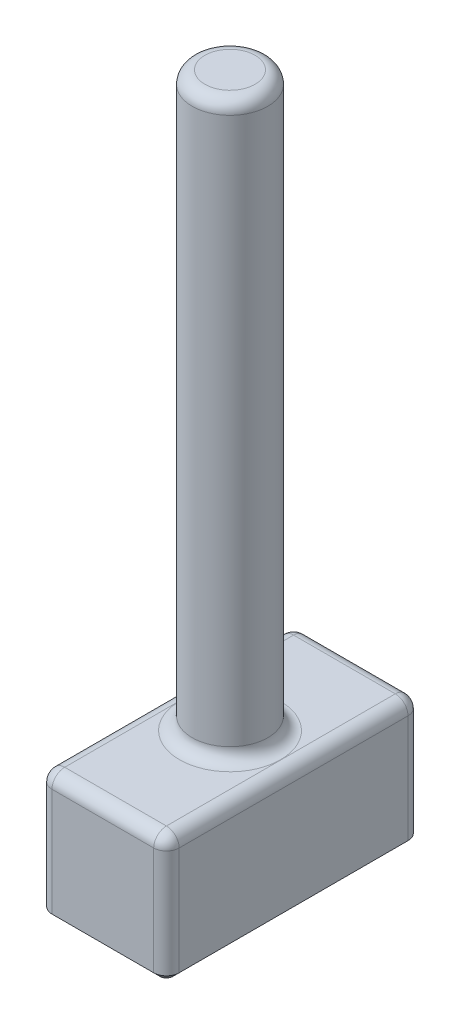
ISO-10303-21;
HEADER;
FILE_DESCRIPTION(('STEP AP214'),'2;1');
FILE_NAME('part.step','',(''),(''),'','','');
FILE_SCHEMA(('AUTOMOTIVE_DESIGN { 1 0 10303 214 1 1 1 1 }'));
ENDSEC;
DATA;
#1=APPLICATION_CONTEXT('core data for automotive mechanical design processes');
#2=APPLICATION_PROTOCOL_DEFINITION('international standard','automotive_design',2000,#1);
#3=PRODUCT_CONTEXT('',#1,'mechanical');
#4=PRODUCT('Part','Part','',(#3));
#5=PRODUCT_RELATED_PRODUCT_CATEGORY('part','',(#4));
#6=PRODUCT_DEFINITION_FORMATION('','',#4);
#7=PRODUCT_DEFINITION_CONTEXT('part definition',#1,'design');
#8=PRODUCT_DEFINITION('design','',#6,#7);
#9=PRODUCT_DEFINITION_SHAPE('','',#8);
#10=(LENGTH_UNIT() NAMED_UNIT(*) SI_UNIT(.MILLI.,.METRE.));
#11=(NAMED_UNIT(*) PLANE_ANGLE_UNIT() SI_UNIT($,.RADIAN.));
#12=(NAMED_UNIT(*) SI_UNIT($,.STERADIAN.) SOLID_ANGLE_UNIT());
#13=UNCERTAINTY_MEASURE_WITH_UNIT(LENGTH_MEASURE(1.E-05),#10,'distance_accuracy_value','');
#14=(GEOMETRIC_REPRESENTATION_CONTEXT(3) GLOBAL_UNCERTAINTY_ASSIGNED_CONTEXT((#13)) GLOBAL_UNIT_ASSIGNED_CONTEXT((#10,
#11,#12)) REPRESENTATION_CONTEXT('',''));
#15=CARTESIAN_POINT('',(0.,0.,0.));
#16=DIRECTION('',(0.,0.,1.));
#17=DIRECTION('',(1.,0.,0.));
#18=AXIS2_PLACEMENT_3D('',#15,#16,#17);
#19=CARTESIAN_POINT('',(0.,50.,0.));
#20=DIRECTION('',(0.,-1.,0.));
#21=DIRECTION('',(0.,0.,-1.));
#22=AXIS2_PLACEMENT_3D('',#19,#20,#21);
#23=CYLINDRICAL_SURFACE('',#22,2.975);
#24=CARTESIAN_POINT('',(0.,49.,0.));
#25=DIRECTION('',(0.,1.,0.));
#26=DIRECTION('',(0.,0.,1.));
#27=AXIS2_PLACEMENT_3D('',#24,#25,#26);
#28=CIRCLE('',#27,2.975);
#29=CARTESIAN_POINT('',(0.,49.,2.975));
#30=VERTEX_POINT('',#29);
#31=EDGE_CURVE('E174',#30,#30,#28,.F.);
#32=ORIENTED_EDGE('',*,*,#31,.T.);
#33=EDGE_LOOP('',(#32));
#34=FACE_BOUND('',#33,.T.);
#35=CARTESIAN_POINT('',(0.,6.00000249306372,0.));
#36=DIRECTION('',(0.,-1.,0.));
#37=DIRECTION('',(0.,0.,-1.));
#38=AXIS2_PLACEMENT_3D('',#35,#36,#37);
#39=CIRCLE('',#38,2.975);
#40=CARTESIAN_POINT('',(0.,6.00000249306372,-2.975));
#41=VERTEX_POINT('',#40);
#42=EDGE_CURVE('E177',#41,#41,#39,.F.);
#43=ORIENTED_EDGE('',*,*,#42,.T.);
#44=EDGE_LOOP('',(#43));
#45=FACE_BOUND('',#44,.T.);
#46=ADVANCED_FACE('F35',(#34,#45),#23,.T.);
#47=CARTESIAN_POINT('',(0.,50.,0.));
#48=DIRECTION('',(0.,1.,0.));
#49=DIRECTION('',(0.,0.,1.));
#50=AXIS2_PLACEMENT_3D('',#47,#48,#49);
#51=PLANE('',#50);
#52=CARTESIAN_POINT('',(0.,50.,0.));
#53=DIRECTION('',(0.,1.,0.));
#54=DIRECTION('',(0.,0.,1.));
#55=AXIS2_PLACEMENT_3D('',#52,#53,#54);
#56=CIRCLE('',#55,1.975);
#57=CARTESIAN_POINT('',(0.,50.,1.975));
#58=VERTEX_POINT('',#57);
#59=EDGE_CURVE('E237',#58,#58,#56,.T.);
#60=ORIENTED_EDGE('',*,*,#59,.T.);
#61=EDGE_LOOP('',(#60));
#62=FACE_BOUND('',#61,.T.);
#63=ADVANCED_FACE('F360',(#62),#51,.T.);
#64=CARTESIAN_POINT('',(5.00000249306372,-5.00000249306372,10.));
#65=DIRECTION('',(-1.,0.,0.));
#66=DIRECTION('',(0.,0.,1.));
#67=AXIS2_PLACEMENT_3D('',#64,#65,#66);
#68=PLANE('',#67);
#69=DIRECTION('',(0.,1.,0.));
#70=VECTOR('',#69,1.);
#71=CARTESIAN_POINT('',(5.00000249306372,-5.00000249306372,9.));
#72=LINE('',#71,#70);
#73=CARTESIAN_POINT('',(5.00000249306372,4.00000249306372,9.));
#74=VERTEX_POINT('',#73);
#75=CARTESIAN_POINT('',(5.00000249306372,-4.50000249306372,9.));
#76=VERTEX_POINT('',#75);
#77=EDGE_CURVE('E156',#74,#76,#72,.F.);
#78=ORIENTED_EDGE('',*,*,#77,.T.);
#79=DIRECTION('',(0.,0.,-1.));
#80=VECTOR('',#79,1.);
#81=CARTESIAN_POINT('',(5.00000249306372,-4.50000249306372,10.));
#82=LINE('',#81,#80);
#83=CARTESIAN_POINT('',(5.00000249306372,-4.50000249306372,-9.));
#84=VERTEX_POINT('',#83);
#85=EDGE_CURVE('E212',#76,#84,#82,.T.);
#86=ORIENTED_EDGE('',*,*,#85,.T.);
#87=DIRECTION('',(0.,1.,0.));
#88=VECTOR('',#87,1.);
#89=CARTESIAN_POINT('',(5.00000249306372,5.00000249306372,-9.));
#90=LINE('',#89,#88);
#91=CARTESIAN_POINT('',(5.00000249306372,4.00000249306372,-9.));
#92=VERTEX_POINT('',#91);
#93=EDGE_CURVE('E198',#84,#92,#90,.T.);
#94=ORIENTED_EDGE('',*,*,#93,.T.);
#95=DIRECTION('',(0.,0.,-1.));
#96=VECTOR('',#95,1.);
#97=CARTESIAN_POINT('',(5.00000249306372,4.00000249306372,10.));
#98=LINE('',#97,#96);
#99=EDGE_CURVE('E195',#92,#74,#98,.F.);
#100=ORIENTED_EDGE('',*,*,#99,.T.);
#101=EDGE_LOOP('',(#78,#86,#94,#100));
#102=FACE_BOUND('',#101,.T.);
#103=ADVANCED_FACE('F309',(#102),#68,.F.);
#104=CARTESIAN_POINT('',(-5.00000249306372,5.00000249306372,10.));
#105=DIRECTION('',(0.,-1.,0.));
#106=DIRECTION('',(0.,0.,-1.));
#107=AXIS2_PLACEMENT_3D('',#104,#105,#106);
#108=PLANE('',#107);
#109=DIRECTION('',(0.,0.,-1.));
#110=VECTOR('',#109,1.);
#111=CARTESIAN_POINT('',(-4.00000249306372,5.00000249306372,10.));
#112=LINE('',#111,#110);
#113=CARTESIAN_POINT('',(-4.00000249306372,5.00000249306372,-9.));
#114=VERTEX_POINT('',#113);
#115=CARTESIAN_POINT('',(-4.00000249306372,5.00000249306372,9.));
#116=VERTEX_POINT('',#115);
#117=EDGE_CURVE('E207',#114,#116,#112,.F.);
#118=ORIENTED_EDGE('',*,*,#117,.T.);
#119=DIRECTION('',(-1.,0.,0.));
#120=VECTOR('',#119,1.);
#121=CARTESIAN_POINT('',(-5.00000249306372,5.00000249306372,9.));
#122=LINE('',#121,#120);
#123=CARTESIAN_POINT('',(4.00000249306372,5.00000249306372,9.));
#124=VERTEX_POINT('',#123);
#125=EDGE_CURVE('E209',#116,#124,#122,.F.);
#126=ORIENTED_EDGE('',*,*,#125,.T.);
#127=DIRECTION('',(0.,0.,-1.));
#128=VECTOR('',#127,1.);
#129=CARTESIAN_POINT('',(4.00000249306372,5.00000249306372,10.));
#130=LINE('',#129,#128);
#131=CARTESIAN_POINT('',(4.00000249306372,5.00000249306372,-9.));
#132=VERTEX_POINT('',#131);
#133=EDGE_CURVE('E203',#124,#132,#130,.T.);
#134=ORIENTED_EDGE('',*,*,#133,.T.);
#135=DIRECTION('',(-1.,0.,0.));
#136=VECTOR('',#135,1.);
#137=CARTESIAN_POINT('',(-5.00000249306372,5.00000249306372,-9.));
#138=LINE('',#137,#136);
#139=EDGE_CURVE('E205',#132,#114,#138,.T.);
#140=ORIENTED_EDGE('',*,*,#139,.T.);
#141=EDGE_LOOP('',(#118,#126,#134,#140));
#142=FACE_BOUND('',#141,.T.);
#143=CARTESIAN_POINT('',(0.,5.00000249306372,0.));
#144=DIRECTION('',(0.,-1.,0.));
#145=DIRECTION('',(0.,0.,-1.));
#146=AXIS2_PLACEMENT_3D('',#143,#144,#145);
#147=CIRCLE('',#146,3.975);
#148=CARTESIAN_POINT('',(0.,5.00000249306372,-3.975));
#149=VERTEX_POINT('',#148);
#150=EDGE_CURVE('E200',#149,#149,#147,.T.);
#151=ORIENTED_EDGE('',*,*,#150,.T.);
#152=EDGE_LOOP('',(#151));
#153=FACE_BOUND('',#152,.T.);
#154=ADVANCED_FACE('F318',(#142,#153),#108,.F.);
#155=CARTESIAN_POINT('',(-5.00000249306372,-5.00000249306372,10.));
#156=DIRECTION('',(1.,0.,0.));
#157=DIRECTION('',(0.,0.,-1.));
#158=AXIS2_PLACEMENT_3D('',#155,#156,#157);
#159=PLANE('',#158);
#160=DIRECTION('',(0.,-1.,0.));
#161=VECTOR('',#160,1.);
#162=CARTESIAN_POINT('',(-5.00000249306372,-5.00000249306372,-9.));
#163=LINE('',#162,#161);
#164=CARTESIAN_POINT('',(-5.00000249306372,4.00000249306372,-9.));
#165=VERTEX_POINT('',#164);
#166=CARTESIAN_POINT('',(-5.00000249306372,-4.50000249306372,-9.));
#167=VERTEX_POINT('',#166);
#168=EDGE_CURVE('E184',#165,#167,#163,.T.);
#169=ORIENTED_EDGE('',*,*,#168,.T.);
#170=DIRECTION('',(0.,0.,1.));
#171=VECTOR('',#170,1.);
#172=CARTESIAN_POINT('',(-5.00000249306372,-4.50000249306372,10.));
#173=LINE('',#172,#171);
#174=CARTESIAN_POINT('',(-5.00000249306372,-4.50000249306372,9.));
#175=VERTEX_POINT('',#174);
#176=EDGE_CURVE('E11',#167,#175,#173,.T.);
#177=ORIENTED_EDGE('',*,*,#176,.T.);
#178=DIRECTION('',(0.,-1.,0.));
#179=VECTOR('',#178,1.);
#180=CARTESIAN_POINT('',(-5.00000249306372,-5.00000249306372,9.));
#181=LINE('',#180,#179);
#182=CARTESIAN_POINT('',(-5.00000249306372,4.00000249306372,9.));
#183=VERTEX_POINT('',#182);
#184=EDGE_CURVE('E186',#175,#183,#181,.F.);
#185=ORIENTED_EDGE('',*,*,#184,.T.);
#186=DIRECTION('',(0.,0.,-1.));
#187=VECTOR('',#186,1.);
#188=CARTESIAN_POINT('',(-5.00000249306372,4.00000249306372,10.));
#189=LINE('',#188,#187);
#190=EDGE_CURVE('E182',#183,#165,#189,.T.);
#191=ORIENTED_EDGE('',*,*,#190,.T.);
#192=EDGE_LOOP('',(#169,#177,#185,#191));
#193=FACE_BOUND('',#192,.T.);
#194=ADVANCED_FACE('F330',(#193),#159,.F.);
#195=CARTESIAN_POINT('',(-5.00000249306372,-5.00000249306372,10.));
#196=DIRECTION('',(0.,1.,0.));
#197=DIRECTION('',(0.,0.,1.));
#198=AXIS2_PLACEMENT_3D('',#195,#196,#197);
#199=PLANE('',#198);
#200=CARTESIAN_POINT('',(4.00000249306372,-5.00000249306372,-9.));
#201=DIRECTION('',(0.,1.,0.));
#202=DIRECTION('',(0.,0.,1.));
#203=AXIS2_PLACEMENT_3D('',#200,#201,#202);
#204=CIRCLE('',#203,0.5);
#205=CARTESIAN_POINT('',(4.00000249306372,-5.00000249306372,-9.5));
#206=VERTEX_POINT('',#205);
#207=CARTESIAN_POINT('',(4.50000249306372,-5.00000249306372,-9.));
#208=VERTEX_POINT('',#207);
#209=EDGE_CURVE('E250',#206,#208,#204,.F.);
#210=ORIENTED_EDGE('',*,*,#209,.T.);
#211=DIRECTION('',(0.,0.,1.));
#212=VECTOR('',#211,1.);
#213=CARTESIAN_POINT('',(4.50000249306372,-5.00000249306372,10.));
#214=LINE('',#213,#212);
#215=CARTESIAN_POINT('',(4.50000249306372,-5.00000249306372,9.));
#216=VERTEX_POINT('',#215);
#217=EDGE_CURVE('E254',#208,#216,#214,.T.);
#218=ORIENTED_EDGE('',*,*,#217,.T.);
#219=CARTESIAN_POINT('',(4.00000249306372,-5.00000249306372,9.));
#220=DIRECTION('',(0.,1.,0.));
#221=DIRECTION('',(0.,0.,1.));
#222=AXIS2_PLACEMENT_3D('',#219,#220,#221);
#223=CIRCLE('',#222,0.499999999999999);
#224=CARTESIAN_POINT('',(4.00000249306372,-5.00000249306372,9.5));
#225=VERTEX_POINT('',#224);
#226=EDGE_CURVE('E252',#216,#225,#223,.F.);
#227=ORIENTED_EDGE('',*,*,#226,.T.);
#228=DIRECTION('',(-1.,0.,0.));
#229=VECTOR('',#228,1.);
#230=CARTESIAN_POINT('',(-5.00000249306372,-5.00000249306372,9.5));
#231=LINE('',#230,#229);
#232=CARTESIAN_POINT('',(-4.00000249306372,-5.00000249306372,9.5));
#233=VERTEX_POINT('',#232);
#234=EDGE_CURVE('E248',#225,#233,#231,.T.);
#235=ORIENTED_EDGE('',*,*,#234,.T.);
#236=CARTESIAN_POINT('',(-4.00000249306372,-5.00000249306372,9.));
#237=DIRECTION('',(0.,1.,0.));
#238=DIRECTION('',(0.,0.,1.));
#239=AXIS2_PLACEMENT_3D('',#236,#237,#238);
#240=CIRCLE('',#239,0.5);
#241=CARTESIAN_POINT('',(-4.50000249306372,-5.00000249306372,9.));
#242=VERTEX_POINT('',#241);
#243=EDGE_CURVE('E244',#233,#242,#240,.F.);
#244=ORIENTED_EDGE('',*,*,#243,.T.);
#245=DIRECTION('',(0.,0.,-1.));
#246=VECTOR('',#245,1.);
#247=CARTESIAN_POINT('',(-4.50000249306372,-5.00000249306372,10.));
#248=LINE('',#247,#246);
#249=CARTESIAN_POINT('',(-4.50000249306372,-5.00000249306372,-9.));
#250=VERTEX_POINT('',#249);
#251=EDGE_CURVE('E240',#242,#250,#248,.T.);
#252=ORIENTED_EDGE('',*,*,#251,.T.);
#253=CARTESIAN_POINT('',(-4.00000249306372,-5.00000249306372,-9.));
#254=DIRECTION('',(0.,1.,0.));
#255=DIRECTION('',(0.,0.,1.));
#256=AXIS2_PLACEMENT_3D('',#253,#254,#255);
#257=CIRCLE('',#256,0.499999999999999);
#258=CARTESIAN_POINT('',(-4.00000249306372,-5.00000249306372,-9.5));
#259=VERTEX_POINT('',#258);
#260=EDGE_CURVE('E242',#250,#259,#257,.F.);
#261=ORIENTED_EDGE('',*,*,#260,.T.);
#262=DIRECTION('',(1.,0.,0.));
#263=VECTOR('',#262,1.);
#264=CARTESIAN_POINT('',(4.00000249306372,-5.00000249306372,-9.5));
#265=LINE('',#264,#263);
#266=EDGE_CURVE('E246',#259,#206,#265,.T.);
#267=ORIENTED_EDGE('',*,*,#266,.T.);
#268=EDGE_LOOP('',(#210,#218,#227,#235,#244,#252,#261,#267));
#269=FACE_BOUND('',#268,.T.);
#270=ADVANCED_FACE('F297',(#269),#199,.F.);
#271=CARTESIAN_POINT('',(0.,0.,10.));
#272=DIRECTION('',(0.,0.,-1.));
#273=DIRECTION('',(-1.,0.,0.));
#274=AXIS2_PLACEMENT_3D('',#271,#272,#273);
#275=PLANE('',#274);
#276=DIRECTION('',(0.,-1.,0.));
#277=VECTOR('',#276,1.);
#278=CARTESIAN_POINT('',(-4.00000249306372,0.,10.));
#279=LINE('',#278,#277);
#280=CARTESIAN_POINT('',(-4.00000249306372,4.00000249306372,10.));
#281=VERTEX_POINT('',#280);
#282=CARTESIAN_POINT('',(-4.00000249306372,-4.50000249306372,10.));
#283=VERTEX_POINT('',#282);
#284=EDGE_CURVE('E148',#281,#283,#279,.T.);
#285=ORIENTED_EDGE('',*,*,#284,.T.);
#286=DIRECTION('',(1.,0.,0.));
#287=VECTOR('',#286,1.);
#288=CARTESIAN_POINT('',(0.,-4.50000249306372,10.));
#289=LINE('',#288,#287);
#290=CARTESIAN_POINT('',(4.00000249306372,-4.50000249306372,10.));
#291=VERTEX_POINT('',#290);
#292=EDGE_CURVE('E145',#283,#291,#289,.T.);
#293=ORIENTED_EDGE('',*,*,#292,.T.);
#294=DIRECTION('',(0.,1.,0.));
#295=VECTOR('',#294,1.);
#296=CARTESIAN_POINT('',(4.00000249306372,0.,10.));
#297=LINE('',#296,#295);
#298=CARTESIAN_POINT('',(4.00000249306372,4.00000249306372,10.));
#299=VERTEX_POINT('',#298);
#300=EDGE_CURVE('E137',#291,#299,#297,.T.);
#301=ORIENTED_EDGE('',*,*,#300,.T.);
#302=DIRECTION('',(-1.,0.,0.));
#303=VECTOR('',#302,1.);
#304=CARTESIAN_POINT('',(0.,4.00000249306372,10.));
#305=LINE('',#304,#303);
#306=EDGE_CURVE('E142',#299,#281,#305,.T.);
#307=ORIENTED_EDGE('',*,*,#306,.T.);
#308=EDGE_LOOP('',(#285,#293,#301,#307));
#309=FACE_BOUND('',#308,.T.);
#310=ADVANCED_FACE('F140',(#309),#275,.F.);
#311=CARTESIAN_POINT('',(0.,0.,-10.));
#312=DIRECTION('',(0.,0.,-1.));
#313=DIRECTION('',(-1.,0.,0.));
#314=AXIS2_PLACEMENT_3D('',#311,#312,#313);
#315=PLANE('',#314);
#316=DIRECTION('',(0.,1.,0.));
#317=VECTOR('',#316,1.);
#318=CARTESIAN_POINT('',(4.00000249306372,-5.00000249306372,-10.));
#319=LINE('',#318,#317);
#320=CARTESIAN_POINT('',(4.00000249306372,4.00000249306372,-10.));
#321=VERTEX_POINT('',#320);
#322=CARTESIAN_POINT('',(4.00000249306372,-4.50000249306372,-10.));
#323=VERTEX_POINT('',#322);
#324=EDGE_CURVE('E190',#321,#323,#319,.F.);
#325=ORIENTED_EDGE('',*,*,#324,.T.);
#326=DIRECTION('',(-1.,0.,0.));
#327=VECTOR('',#326,1.);
#328=CARTESIAN_POINT('',(-4.00000249306372,-4.50000249306372,-10.));
#329=LINE('',#328,#327);
#330=CARTESIAN_POINT('',(-4.00000249306372,-4.50000249306372,-10.));
#331=VERTEX_POINT('',#330);
#332=EDGE_CURVE('E262',#323,#331,#329,.T.);
#333=ORIENTED_EDGE('',*,*,#332,.T.);
#334=DIRECTION('',(0.,-1.,0.));
#335=VECTOR('',#334,1.);
#336=CARTESIAN_POINT('',(-4.00000249306372,5.00000249306372,-10.));
#337=LINE('',#336,#335);
#338=CARTESIAN_POINT('',(-4.00000249306372,4.00000249306372,-10.));
#339=VERTEX_POINT('',#338);
#340=EDGE_CURVE('E193',#331,#339,#337,.F.);
#341=ORIENTED_EDGE('',*,*,#340,.T.);
#342=DIRECTION('',(-1.,0.,0.));
#343=VECTOR('',#342,1.);
#344=CARTESIAN_POINT('',(5.00000249306372,4.00000249306372,-10.));
#345=LINE('',#344,#343);
#346=EDGE_CURVE('E188',#339,#321,#345,.F.);
#347=ORIENTED_EDGE('',*,*,#346,.T.);
#348=EDGE_LOOP('',(#325,#333,#341,#347));
#349=FACE_BOUND('',#348,.T.);
#350=ADVANCED_FACE('F343',(#349),#315,.T.);
#351=CARTESIAN_POINT('',(0.,49.,0.));
#352=DIRECTION('',(0.,1.,0.));
#353=DIRECTION('',(0.,0.,1.));
#354=AXIS2_PLACEMENT_3D('',#351,#352,#353);
#355=TOROIDAL_SURFACE('',#354,1.975,1.);
#356=ORIENTED_EDGE('',*,*,#31,.F.);
#357=EDGE_LOOP('',(#356));
#358=FACE_BOUND('',#357,.T.);
#359=ORIENTED_EDGE('',*,*,#59,.F.);
#360=EDGE_LOOP('',(#359));
#361=FACE_BOUND('',#360,.T.);
#362=ADVANCED_FACE('F357',(#358,#361),#355,.T.);
#363=CARTESIAN_POINT('',(4.00000249306372,-5.00000249306372,-9.));
#364=DIRECTION('',(0.,-1.,0.));
#365=DIRECTION('',(0.,0.,-1.));
#366=AXIS2_PLACEMENT_3D('',#363,#364,#365);
#367=CYLINDRICAL_SURFACE('',#366,1.);
#368=ORIENTED_EDGE('',*,*,#93,.F.);
#369=CARTESIAN_POINT('',(4.00000249306372,-4.50000249306372,-9.));
#370=DIRECTION('',(0.,1.,0.));
#371=DIRECTION('',(0.,0.,1.));
#372=AXIS2_PLACEMENT_3D('',#369,#370,#371);
#373=CIRCLE('',#372,1.);
#374=EDGE_CURVE('E259',#84,#323,#373,.T.);
#375=ORIENTED_EDGE('',*,*,#374,.T.);
#376=ORIENTED_EDGE('',*,*,#324,.F.);
#377=CARTESIAN_POINT('',(4.00000249306372,4.00000249306372,-9.));
#378=DIRECTION('',(0.,1.,0.));
#379=DIRECTION('',(0.,0.,1.));
#380=AXIS2_PLACEMENT_3D('',#377,#378,#379);
#381=CIRCLE('',#380,1.);
#382=EDGE_CURVE('E234',#92,#321,#381,.T.);
#383=ORIENTED_EDGE('',*,*,#382,.F.);
#384=EDGE_LOOP('',(#368,#375,#376,#383));
#385=FACE_BOUND('',#384,.T.);
#386=ADVANCED_FACE('F346',(#385),#367,.T.);
#387=CARTESIAN_POINT('',(4.00000249306372,4.00000249306372,-9.));
#388=DIRECTION('',(0.,0.,-1.));
#389=DIRECTION('',(-1.,0.,0.));
#390=AXIS2_PLACEMENT_3D('',#387,#388,#389);
#391=SPHERICAL_SURFACE('',#390,1.);
#392=CARTESIAN_POINT('',(4.00000249306372,4.00000249306372,-9.));
#393=DIRECTION('',(0.,0.,-1.));
#394=DIRECTION('',(-1.,0.,0.));
#395=AXIS2_PLACEMENT_3D('',#392,#393,#394);
#396=CIRCLE('',#395,1.);
#397=EDGE_CURVE('E228',#92,#132,#396,.F.);
#398=ORIENTED_EDGE('',*,*,#397,.F.);
#399=ORIENTED_EDGE('',*,*,#382,.T.);
#400=CARTESIAN_POINT('',(4.00000249306372,4.00000249306372,-9.));
#401=DIRECTION('',(1.,0.,0.));
#402=DIRECTION('',(0.,1.,0.));
#403=AXIS2_PLACEMENT_3D('',#400,#401,#402);
#404=CIRCLE('',#403,1.);
#405=EDGE_CURVE('E231',#132,#321,#404,.F.);
#406=ORIENTED_EDGE('',*,*,#405,.F.);
#407=EDGE_LOOP('',(#398,#399,#406));
#408=FACE_BOUND('',#407,.T.);
#409=ADVANCED_FACE('F349',(#408),#391,.T.);
#410=CARTESIAN_POINT('',(-4.00000249306372,-5.00000249306372,-9.));
#411=DIRECTION('',(0.,1.,0.));
#412=DIRECTION('',(0.,0.,1.));
#413=AXIS2_PLACEMENT_3D('',#410,#411,#412);
#414=CYLINDRICAL_SURFACE('',#413,1.);
#415=ORIENTED_EDGE('',*,*,#340,.F.);
#416=CARTESIAN_POINT('',(-4.00000249306372,-4.50000249306372,-9.));
#417=DIRECTION('',(0.,1.,0.));
#418=DIRECTION('',(0.,0.,1.));
#419=AXIS2_PLACEMENT_3D('',#416,#417,#418);
#420=CIRCLE('',#419,1.);
#421=EDGE_CURVE('E45',#331,#167,#420,.T.);
#422=ORIENTED_EDGE('',*,*,#421,.T.);
#423=ORIENTED_EDGE('',*,*,#168,.F.);
#424=CARTESIAN_POINT('',(-4.00000249306372,4.00000249306372,-9.));
#425=DIRECTION('',(0.,1.,0.));
#426=DIRECTION('',(-1.,0.,0.));
#427=AXIS2_PLACEMENT_3D('',#424,#425,#426);
#428=CIRCLE('',#427,1.);
#429=EDGE_CURVE('E225',#339,#165,#428,.T.);
#430=ORIENTED_EDGE('',*,*,#429,.F.);
#431=EDGE_LOOP('',(#415,#422,#423,#430));
#432=FACE_BOUND('',#431,.T.);
#433=ADVANCED_FACE('F332',(#432),#414,.T.);
#434=CARTESIAN_POINT('',(-5.00000249306372,4.00000249306372,-9.));
#435=DIRECTION('',(1.,0.,0.));
#436=DIRECTION('',(0.,0.,-1.));
#437=AXIS2_PLACEMENT_3D('',#434,#435,#436);
#438=CYLINDRICAL_SURFACE('',#437,1.);
#439=ORIENTED_EDGE('',*,*,#405,.T.);
#440=ORIENTED_EDGE('',*,*,#346,.F.);
#441=CARTESIAN_POINT('',(-4.00000249306372,4.00000249306372,-9.));
#442=DIRECTION('',(-1.,0.,0.));
#443=DIRECTION('',(0.,0.,1.));
#444=AXIS2_PLACEMENT_3D('',#441,#442,#443);
#445=CIRCLE('',#444,1.);
#446=EDGE_CURVE('E222',#114,#339,#445,.T.);
#447=ORIENTED_EDGE('',*,*,#446,.F.);
#448=ORIENTED_EDGE('',*,*,#139,.F.);
#449=EDGE_LOOP('',(#439,#440,#447,#448));
#450=FACE_BOUND('',#449,.T.);
#451=ADVANCED_FACE('F340',(#450),#438,.T.);
#452=CARTESIAN_POINT('',(4.00000249306372,4.00000249306372,10.));
#453=DIRECTION('',(0.,0.,-1.));
#454=DIRECTION('',(-1.,0.,0.));
#455=AXIS2_PLACEMENT_3D('',#452,#453,#454);
#456=CYLINDRICAL_SURFACE('',#455,1.);
#457=ORIENTED_EDGE('',*,*,#397,.T.);
#458=ORIENTED_EDGE('',*,*,#133,.F.);
#459=CARTESIAN_POINT('',(4.00000249306372,4.00000249306372,9.));
#460=DIRECTION('',(0.,0.,1.));
#461=DIRECTION('',(1.,0.,0.));
#462=AXIS2_PLACEMENT_3D('',#459,#460,#461);
#463=CIRCLE('',#462,1.);
#464=EDGE_CURVE('E160',#74,#124,#463,.T.);
#465=ORIENTED_EDGE('',*,*,#464,.F.);
#466=ORIENTED_EDGE('',*,*,#99,.F.);
#467=EDGE_LOOP('',(#457,#458,#465,#466));
#468=FACE_BOUND('',#467,.T.);
#469=ADVANCED_FACE('F314',(#468),#456,.T.);
#470=CARTESIAN_POINT('',(4.00000249306372,0.,9.));
#471=DIRECTION('',(0.,1.,0.));
#472=DIRECTION('',(0.,0.,1.));
#473=AXIS2_PLACEMENT_3D('',#470,#471,#472);
#474=CYLINDRICAL_SURFACE('',#473,1.);
#475=ORIENTED_EDGE('',*,*,#300,.F.);
#476=CARTESIAN_POINT('',(4.00000249306372,-4.50000249306372,9.));
#477=DIRECTION('',(0.,1.,0.));
#478=DIRECTION('',(0.,0.,1.));
#479=AXIS2_PLACEMENT_3D('',#476,#477,#478);
#480=CIRCLE('',#479,1.);
#481=EDGE_CURVE('E257',#291,#76,#480,.T.);
#482=ORIENTED_EDGE('',*,*,#481,.T.);
#483=ORIENTED_EDGE('',*,*,#77,.F.);
#484=CARTESIAN_POINT('',(4.00000249306372,4.00000249306372,9.));
#485=DIRECTION('',(0.,1.,0.));
#486=DIRECTION('',(0.,0.,1.));
#487=AXIS2_PLACEMENT_3D('',#484,#485,#486);
#488=CIRCLE('',#487,1.);
#489=EDGE_CURVE('E152',#299,#74,#488,.T.);
#490=ORIENTED_EDGE('',*,*,#489,.F.);
#491=EDGE_LOOP('',(#475,#482,#483,#490));
#492=FACE_BOUND('',#491,.T.);
#493=ADVANCED_FACE('F154',(#492),#474,.T.);
#494=CARTESIAN_POINT('',(-4.00000249306372,4.00000249306372,-9.));
#495=DIRECTION('',(0.,0.,-1.));
#496=DIRECTION('',(-1.,0.,0.));
#497=AXIS2_PLACEMENT_3D('',#494,#495,#496);
#498=SPHERICAL_SURFACE('',#497,1.);
#499=ORIENTED_EDGE('',*,*,#446,.T.);
#500=ORIENTED_EDGE('',*,*,#429,.T.);
#501=CARTESIAN_POINT('',(-4.00000249306372,4.00000249306372,-9.));
#502=DIRECTION('',(0.,0.,-1.));
#503=DIRECTION('',(-1.,0.,0.));
#504=AXIS2_PLACEMENT_3D('',#501,#502,#503);
#505=CIRCLE('',#504,1.);
#506=EDGE_CURVE('E161',#114,#165,#505,.F.);
#507=ORIENTED_EDGE('',*,*,#506,.F.);
#508=EDGE_LOOP('',(#499,#500,#507));
#509=FACE_BOUND('',#508,.T.);
#510=ADVANCED_FACE('F335',(#509),#498,.T.);
#511=CARTESIAN_POINT('',(4.00000249306372,4.00000249306372,9.));
#512=DIRECTION('',(1.,0.,0.));
#513=DIRECTION('',(0.,0.,-1.));
#514=AXIS2_PLACEMENT_3D('',#511,#512,#513);
#515=SPHERICAL_SURFACE('',#514,1.);
#516=ORIENTED_EDGE('',*,*,#489,.T.);
#517=ORIENTED_EDGE('',*,*,#464,.T.);
#518=CARTESIAN_POINT('',(4.00000249306372,4.00000249306372,9.));
#519=DIRECTION('',(1.,0.,0.));
#520=DIRECTION('',(0.,0.,-1.));
#521=AXIS2_PLACEMENT_3D('',#518,#519,#520);
#522=CIRCLE('',#521,1.);
#523=EDGE_CURVE('E163',#299,#124,#522,.F.);
#524=ORIENTED_EDGE('',*,*,#523,.F.);
#525=EDGE_LOOP('',(#516,#517,#524));
#526=FACE_BOUND('',#525,.T.);
#527=ADVANCED_FACE('F164',(#526),#515,.T.);
#528=CARTESIAN_POINT('',(-4.00000249306372,4.00000249306372,10.));
#529=DIRECTION('',(0.,0.,-1.));
#530=DIRECTION('',(-1.,0.,0.));
#531=AXIS2_PLACEMENT_3D('',#528,#529,#530);
#532=CYLINDRICAL_SURFACE('',#531,1.);
#533=ORIENTED_EDGE('',*,*,#506,.T.);
#534=ORIENTED_EDGE('',*,*,#190,.F.);
#535=CARTESIAN_POINT('',(-4.00000249306372,4.00000249306372,9.));
#536=DIRECTION('',(0.,0.,1.));
#537=DIRECTION('',(1.,0.,0.));
#538=AXIS2_PLACEMENT_3D('',#535,#536,#537);
#539=CIRCLE('',#538,1.);
#540=EDGE_CURVE('E168',#116,#183,#539,.T.);
#541=ORIENTED_EDGE('',*,*,#540,.F.);
#542=ORIENTED_EDGE('',*,*,#117,.F.);
#543=EDGE_LOOP('',(#533,#534,#541,#542));
#544=FACE_BOUND('',#543,.T.);
#545=ADVANCED_FACE('F324',(#544),#532,.T.);
#546=CARTESIAN_POINT('',(0.,4.00000249306372,9.));
#547=DIRECTION('',(-1.,0.,0.));
#548=DIRECTION('',(0.,0.,1.));
#549=AXIS2_PLACEMENT_3D('',#546,#547,#548);
#550=CYLINDRICAL_SURFACE('',#549,1.);
#551=ORIENTED_EDGE('',*,*,#523,.T.);
#552=ORIENTED_EDGE('',*,*,#125,.F.);
#553=CARTESIAN_POINT('',(-4.00000249306372,4.00000249306372,9.));
#554=DIRECTION('',(-1.,0.,0.));
#555=DIRECTION('',(0.,0.,1.));
#556=AXIS2_PLACEMENT_3D('',#553,#554,#555);
#557=CIRCLE('',#556,1.);
#558=EDGE_CURVE('E172',#281,#116,#557,.T.);
#559=ORIENTED_EDGE('',*,*,#558,.F.);
#560=ORIENTED_EDGE('',*,*,#306,.F.);
#561=EDGE_LOOP('',(#551,#552,#559,#560));
#562=FACE_BOUND('',#561,.T.);
#563=ADVANCED_FACE('F170',(#562),#550,.T.);
#564=CARTESIAN_POINT('',(-4.00000249306372,4.00000249306372,9.));
#565=DIRECTION('',(0.,1.,0.));
#566=DIRECTION('',(0.,0.,1.));
#567=AXIS2_PLACEMENT_3D('',#564,#565,#566);
#568=SPHERICAL_SURFACE('',#567,1.);
#569=ORIENTED_EDGE('',*,*,#558,.T.);
#570=ORIENTED_EDGE('',*,*,#540,.T.);
#571=CARTESIAN_POINT('',(-4.00000249306372,4.00000249306372,9.));
#572=DIRECTION('',(0.,1.,0.));
#573=DIRECTION('',(0.,0.,1.));
#574=AXIS2_PLACEMENT_3D('',#571,#572,#573);
#575=CIRCLE('',#574,1.);
#576=EDGE_CURVE('E213',#281,#183,#575,.F.);
#577=ORIENTED_EDGE('',*,*,#576,.F.);
#578=EDGE_LOOP('',(#569,#570,#577));
#579=FACE_BOUND('',#578,.T.);
#580=ADVANCED_FACE('F326',(#579),#568,.T.);
#581=CARTESIAN_POINT('',(-4.00000249306372,0.,9.));
#582=DIRECTION('',(0.,-1.,0.));
#583=DIRECTION('',(0.,0.,-1.));
#584=AXIS2_PLACEMENT_3D('',#581,#582,#583);
#585=CYLINDRICAL_SURFACE('',#584,1.);
#586=ORIENTED_EDGE('',*,*,#184,.F.);
#587=CARTESIAN_POINT('',(-4.00000249306372,-4.50000249306372,9.));
#588=DIRECTION('',(0.,1.,0.));
#589=DIRECTION('',(0.,0.,1.));
#590=AXIS2_PLACEMENT_3D('',#587,#588,#589);
#591=CIRCLE('',#590,1.);
#592=EDGE_CURVE('E264',#175,#283,#591,.T.);
#593=ORIENTED_EDGE('',*,*,#592,.T.);
#594=ORIENTED_EDGE('',*,*,#284,.F.);
#595=ORIENTED_EDGE('',*,*,#576,.T.);
#596=EDGE_LOOP('',(#586,#593,#594,#595));
#597=FACE_BOUND('',#596,.T.);
#598=ADVANCED_FACE('F329',(#597),#585,.T.);
#599=CARTESIAN_POINT('',(0.,6.00000249306372,0.));
#600=DIRECTION('',(0.,-1.,0.));
#601=DIRECTION('',(0.,0.,-1.));
#602=AXIS2_PLACEMENT_3D('',#599,#600,#601);
#603=TOROIDAL_SURFACE('',#602,3.975,1.);
#604=ORIENTED_EDGE('',*,*,#42,.F.);
#605=EDGE_LOOP('',(#604));
#606=FACE_BOUND('',#605,.T.);
#607=ORIENTED_EDGE('',*,*,#150,.F.);
#608=EDGE_LOOP('',(#607));
#609=FACE_BOUND('',#608,.T.);
#610=ADVANCED_FACE('F376',(#606,#609),#603,.F.);
#611=CARTESIAN_POINT('',(-4.50000249306372,-5.00000249306372,10.));
#612=DIRECTION('',(0.707106781186547,0.707106781186547,0.));
#613=DIRECTION('',(0.,0.,-1.));
#614=AXIS2_PLACEMENT_3D('',#611,#612,#613);
#615=PLANE('',#614);
#616=DIRECTION('',(-0.707106781186547,0.707106781186547,0.));
#617=VECTOR('',#616,1.);
#618=CARTESIAN_POINT('',(-4.50000249306372,-5.00000249306372,-9.));
#619=LINE('',#618,#617);
#620=EDGE_CURVE('E282',#250,#167,#619,.T.);
#621=ORIENTED_EDGE('',*,*,#620,.F.);
#622=ORIENTED_EDGE('',*,*,#251,.F.);
#623=DIRECTION('',(0.707106781186547,-0.707106781186547,0.));
#624=VECTOR('',#623,1.);
#625=CARTESIAN_POINT('',(-5.00000249306372,-4.50000249306372,9.));
#626=LINE('',#625,#624);
#627=EDGE_CURVE('E40',#175,#242,#626,.T.);
#628=ORIENTED_EDGE('',*,*,#627,.F.);
#629=ORIENTED_EDGE('',*,*,#176,.F.);
#630=EDGE_LOOP('',(#621,#622,#628,#629));
#631=FACE_BOUND('',#630,.T.);
#632=ADVANCED_FACE('F38',(#631),#615,.F.);
#633=CARTESIAN_POINT('',(-4.00000249306372,-5.00000249306372,9.));
#634=DIRECTION('',(0.,1.,0.));
#635=DIRECTION('',(0.,0.,1.));
#636=AXIS2_PLACEMENT_3D('',#633,#634,#635);
#637=CONICAL_SURFACE('',#636,0.5,0.785398163397448);
#638=ORIENTED_EDGE('',*,*,#627,.T.);
#639=ORIENTED_EDGE('',*,*,#243,.F.);
#640=DIRECTION('',(0.,-0.707106781186547,-0.707106781186547));
#641=VECTOR('',#640,1.);
#642=CARTESIAN_POINT('',(-4.00000249306372,-4.50000249306372,10.));
#643=LINE('',#642,#641);
#644=EDGE_CURVE('E280',#283,#233,#643,.T.);
#645=ORIENTED_EDGE('',*,*,#644,.F.);
#646=ORIENTED_EDGE('',*,*,#592,.F.);
#647=EDGE_LOOP('',(#638,#639,#645,#646));
#648=FACE_BOUND('',#647,.T.);
#649=ADVANCED_FACE('F292',(#648),#637,.T.);
#650=CARTESIAN_POINT('',(-4.00000249306372,-5.00000249306372,-9.));
#651=DIRECTION('',(0.,1.,0.));
#652=DIRECTION('',(0.,0.,1.));
#653=AXIS2_PLACEMENT_3D('',#650,#651,#652);
#654=CONICAL_SURFACE('',#653,0.499999999999999,0.785398163397449);
#655=ORIENTED_EDGE('',*,*,#620,.T.);
#656=ORIENTED_EDGE('',*,*,#421,.F.);
#657=DIRECTION('',(0.,0.707106781186547,-0.707106781186547));
#658=VECTOR('',#657,1.);
#659=CARTESIAN_POINT('',(-4.00000249306372,-5.00000249306372,-9.5));
#660=LINE('',#659,#658);
#661=EDGE_CURVE('E277',#259,#331,#660,.T.);
#662=ORIENTED_EDGE('',*,*,#661,.F.);
#663=ORIENTED_EDGE('',*,*,#260,.F.);
#664=EDGE_LOOP('',(#655,#656,#662,#663));
#665=FACE_BOUND('',#664,.T.);
#666=ADVANCED_FACE('F447',(#665),#654,.T.);
#667=CARTESIAN_POINT('',(0.,-4.50000249306372,10.));
#668=DIRECTION('',(0.,0.707106781186547,-0.707106781186547));
#669=DIRECTION('',(1.,0.,0.));
#670=AXIS2_PLACEMENT_3D('',#667,#668,#669);
#671=PLANE('',#670);
#672=ORIENTED_EDGE('',*,*,#644,.T.);
#673=ORIENTED_EDGE('',*,*,#234,.F.);
#674=DIRECTION('',(0.,-0.707106781186547,-0.707106781186547));
#675=VECTOR('',#674,1.);
#676=CARTESIAN_POINT('',(4.00000249306372,-4.50000249306372,10.));
#677=LINE('',#676,#675);
#678=EDGE_CURVE('E274',#291,#225,#677,.T.);
#679=ORIENTED_EDGE('',*,*,#678,.F.);
#680=ORIENTED_EDGE('',*,*,#292,.F.);
#681=EDGE_LOOP('',(#672,#673,#679,#680));
#682=FACE_BOUND('',#681,.T.);
#683=ADVANCED_FACE('F302',(#682),#671,.F.);
#684=CARTESIAN_POINT('',(-5.00000249306372,-5.00000249306372,-9.5));
#685=DIRECTION('',(0.,-0.707106781186547,-0.707106781186547));
#686=DIRECTION('',(-1.,0.,0.));
#687=AXIS2_PLACEMENT_3D('',#684,#685,#686);
#688=PLANE('',#687);
#689=ORIENTED_EDGE('',*,*,#661,.T.);
#690=ORIENTED_EDGE('',*,*,#332,.F.);
#691=DIRECTION('',(0.,0.707106781186547,-0.707106781186547));
#692=VECTOR('',#691,1.);
#693=CARTESIAN_POINT('',(4.00000249306372,-5.00000249306372,-9.5));
#694=LINE('',#693,#692);
#695=EDGE_CURVE('E271',#206,#323,#694,.T.);
#696=ORIENTED_EDGE('',*,*,#695,.F.);
#697=ORIENTED_EDGE('',*,*,#266,.F.);
#698=EDGE_LOOP('',(#689,#690,#696,#697));
#699=FACE_BOUND('',#698,.T.);
#700=ADVANCED_FACE('F459',(#699),#688,.T.);
#701=CARTESIAN_POINT('',(4.00000249306372,-5.00000249306372,9.));
#702=DIRECTION('',(0.,1.,0.));
#703=DIRECTION('',(0.,0.,1.));
#704=AXIS2_PLACEMENT_3D('',#701,#702,#703);
#705=CONICAL_SURFACE('',#704,0.499999999999999,0.785398163397449);
#706=ORIENTED_EDGE('',*,*,#678,.T.);
#707=ORIENTED_EDGE('',*,*,#226,.F.);
#708=DIRECTION('',(-0.707106781186548,-0.707106781186547,0.));
#709=VECTOR('',#708,1.);
#710=CARTESIAN_POINT('',(5.00000249306372,-4.50000249306372,9.));
#711=LINE('',#710,#709);
#712=EDGE_CURVE('E269',#76,#216,#711,.T.);
#713=ORIENTED_EDGE('',*,*,#712,.F.);
#714=ORIENTED_EDGE('',*,*,#481,.F.);
#715=EDGE_LOOP('',(#706,#707,#713,#714));
#716=FACE_BOUND('',#715,.T.);
#717=ADVANCED_FACE('F305',(#716),#705,.T.);
#718=CARTESIAN_POINT('',(4.00000249306372,-5.00000249306372,-9.));
#719=DIRECTION('',(0.,1.,0.));
#720=DIRECTION('',(0.,0.,1.));
#721=AXIS2_PLACEMENT_3D('',#718,#719,#720);
#722=CONICAL_SURFACE('',#721,0.5,0.785398163397448);
#723=ORIENTED_EDGE('',*,*,#695,.T.);
#724=ORIENTED_EDGE('',*,*,#374,.F.);
#725=DIRECTION('',(0.707106781186547,0.707106781186547,0.));
#726=VECTOR('',#725,1.);
#727=CARTESIAN_POINT('',(4.50000249306372,-5.00000249306372,-9.));
#728=LINE('',#727,#726);
#729=EDGE_CURVE('E267',#208,#84,#728,.T.);
#730=ORIENTED_EDGE('',*,*,#729,.F.);
#731=ORIENTED_EDGE('',*,*,#209,.F.);
#732=EDGE_LOOP('',(#723,#724,#730,#731));
#733=FACE_BOUND('',#732,.T.);
#734=ADVANCED_FACE('F473',(#733),#722,.T.);
#735=CARTESIAN_POINT('',(5.00000249306372,-4.50000249306372,10.));
#736=DIRECTION('',(-0.707106781186547,0.707106781186547,0.));
#737=DIRECTION('',(0.,0.,-1.));
#738=AXIS2_PLACEMENT_3D('',#735,#736,#737);
#739=PLANE('',#738);
#740=ORIENTED_EDGE('',*,*,#712,.T.);
#741=ORIENTED_EDGE('',*,*,#217,.F.);
#742=ORIENTED_EDGE('',*,*,#729,.T.);
#743=ORIENTED_EDGE('',*,*,#85,.F.);
#744=EDGE_LOOP('',(#740,#741,#742,#743));
#745=FACE_BOUND('',#744,.T.);
#746=ADVANCED_FACE('F480',(#745),#739,.F.);
#747=CLOSED_SHELL('',(#46,#63,#103,#154,#194,#270,#310,#350,#362,#386,#409,#433,#451,#469,#493,
#510,#527,#545,#563,#580,#598,#610,#632,#649,#666,#683,#700,#717,#734,#746));
#748=MANIFOLD_SOLID_BREP('B2',#747);
#749=ADVANCED_BREP_SHAPE_REPRESENTATION('',(#18,#748),#14);
#750=SHAPE_DEFINITION_REPRESENTATION(#9,#749);
ENDSEC;
END-ISO-10303-21;
